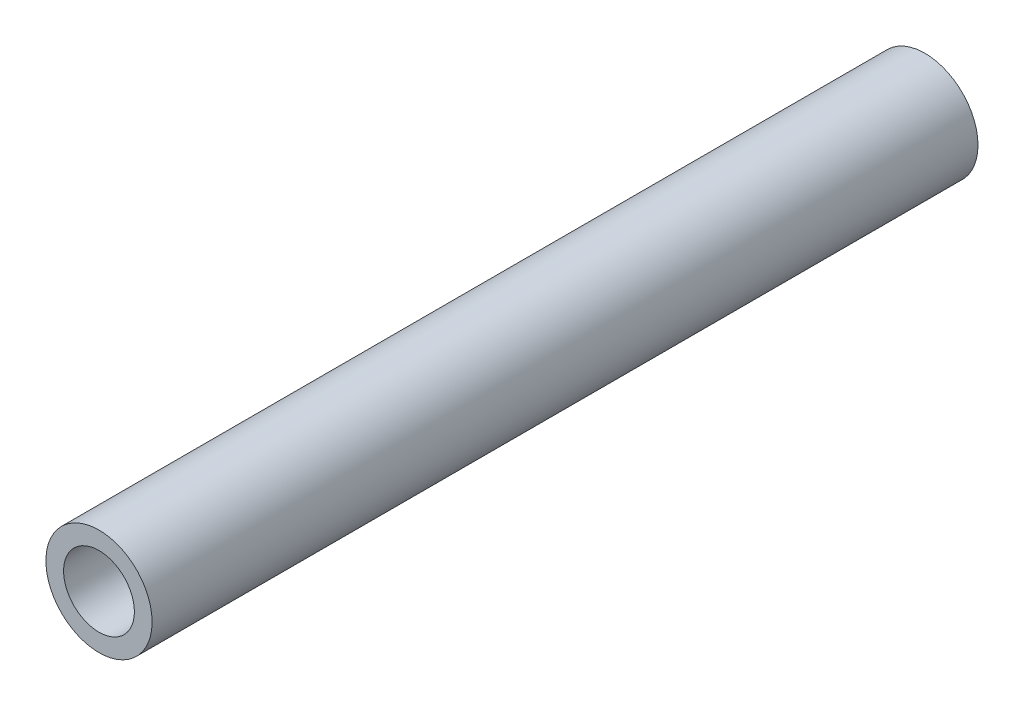
ISO-10303-21;
HEADER;
FILE_DESCRIPTION(('STEP AP214'),'2;1');
FILE_NAME('part.step','',(''),(''),'','','');
FILE_SCHEMA(('AUTOMOTIVE_DESIGN { 1 0 10303 214 1 1 1 1 }'));
ENDSEC;
DATA;
#1=APPLICATION_CONTEXT('core data for automotive mechanical design processes');
#2=APPLICATION_PROTOCOL_DEFINITION('international standard','automotive_design',2000,#1);
#3=PRODUCT_CONTEXT('',#1,'mechanical');
#4=PRODUCT('Part','Part','',(#3));
#5=PRODUCT_RELATED_PRODUCT_CATEGORY('part','',(#4));
#6=PRODUCT_DEFINITION_FORMATION('','',#4);
#7=PRODUCT_DEFINITION_CONTEXT('part definition',#1,'design');
#8=PRODUCT_DEFINITION('design','',#6,#7);
#9=PRODUCT_DEFINITION_SHAPE('','',#8);
#10=(LENGTH_UNIT() NAMED_UNIT(*) SI_UNIT(.MILLI.,.METRE.));
#11=(NAMED_UNIT(*) PLANE_ANGLE_UNIT() SI_UNIT($,.RADIAN.));
#12=(NAMED_UNIT(*) SI_UNIT($,.STERADIAN.) SOLID_ANGLE_UNIT());
#13=UNCERTAINTY_MEASURE_WITH_UNIT(LENGTH_MEASURE(1.E-05),#10,'distance_accuracy_value','');
#14=(GEOMETRIC_REPRESENTATION_CONTEXT(3) GLOBAL_UNCERTAINTY_ASSIGNED_CONTEXT((#13)) GLOBAL_UNIT_ASSIGNED_CONTEXT((#10,
#11,#12)) REPRESENTATION_CONTEXT('',''));
#15=CARTESIAN_POINT('',(0.,0.,0.));
#16=DIRECTION('',(0.,0.,1.));
#17=DIRECTION('',(1.,0.,0.));
#18=AXIS2_PLACEMENT_3D('',#15,#16,#17);
#19=CARTESIAN_POINT('',(0.,0.,35.));
#20=DIRECTION('',(0.,0.,1.));
#21=DIRECTION('',(1.,0.,0.));
#22=AXIS2_PLACEMENT_3D('',#19,#20,#21);
#23=PLANE('',#22);
#24=CARTESIAN_POINT('',(0.,0.,35.));
#25=DIRECTION('',(0.,0.,1.));
#26=DIRECTION('',(1.,0.,0.));
#27=AXIS2_PLACEMENT_3D('',#24,#25,#26);
#28=CIRCLE('',#27,2.25);
#29=CARTESIAN_POINT('',(2.25,0.,35.));
#30=VERTEX_POINT('',#29);
#31=EDGE_CURVE('E10',#30,#30,#28,.T.);
#32=ORIENTED_EDGE('',*,*,#31,.T.);
#33=EDGE_LOOP('',(#32));
#34=FACE_BOUND('',#33,.T.);
#35=CARTESIAN_POINT('',(0.,0.,35.));
#36=DIRECTION('',(0.,0.,1.));
#37=DIRECTION('',(1.,0.,0.));
#38=AXIS2_PLACEMENT_3D('',#35,#36,#37);
#39=CIRCLE('',#38,1.5);
#40=CARTESIAN_POINT('',(1.5,0.,35.));
#41=VERTEX_POINT('',#40);
#42=EDGE_CURVE('E41',#41,#41,#39,.T.);
#43=ORIENTED_EDGE('',*,*,#42,.F.);
#44=EDGE_LOOP('',(#43));
#45=FACE_BOUND('',#44,.T.);
#46=ADVANCED_FACE('F30',(#34,#45),#23,.T.);
#47=CARTESIAN_POINT('',(0.,0.,0.));
#48=DIRECTION('',(0.,0.,1.));
#49=DIRECTION('',(1.,0.,0.));
#50=AXIS2_PLACEMENT_3D('',#47,#48,#49);
#51=PLANE('',#50);
#52=CARTESIAN_POINT('',(0.,0.,0.));
#53=DIRECTION('',(0.,0.,1.));
#54=DIRECTION('',(1.,0.,0.));
#55=AXIS2_PLACEMENT_3D('',#52,#53,#54);
#56=CIRCLE('',#55,2.25);
#57=CARTESIAN_POINT('',(2.25,0.,0.));
#58=VERTEX_POINT('',#57);
#59=EDGE_CURVE('E34',#58,#58,#56,.T.);
#60=ORIENTED_EDGE('',*,*,#59,.F.);
#61=EDGE_LOOP('',(#60));
#62=FACE_BOUND('',#61,.T.);
#63=CARTESIAN_POINT('',(0.,0.,0.));
#64=DIRECTION('',(0.,0.,1.));
#65=DIRECTION('',(1.,0.,0.));
#66=AXIS2_PLACEMENT_3D('',#63,#64,#65);
#67=CIRCLE('',#66,1.5);
#68=CARTESIAN_POINT('',(1.5,0.,0.));
#69=VERTEX_POINT('',#68);
#70=EDGE_CURVE('E43',#69,#69,#67,.T.);
#71=ORIENTED_EDGE('',*,*,#70,.T.);
#72=EDGE_LOOP('',(#71));
#73=FACE_BOUND('',#72,.T.);
#74=ADVANCED_FACE('F53',(#62,#73),#51,.F.);
#75=CARTESIAN_POINT('',(0.,0.,35.));
#76=DIRECTION('',(0.,0.,-1.));
#77=DIRECTION('',(-1.,0.,0.));
#78=AXIS2_PLACEMENT_3D('',#75,#76,#77);
#79=CYLINDRICAL_SURFACE('',#78,2.25);
#80=ORIENTED_EDGE('',*,*,#31,.F.);
#81=EDGE_LOOP('',(#80));
#82=FACE_BOUND('',#81,.T.);
#83=ORIENTED_EDGE('',*,*,#59,.T.);
#84=EDGE_LOOP('',(#83));
#85=FACE_BOUND('',#84,.T.);
#86=ADVANCED_FACE('F32',(#82,#85),#79,.T.);
#87=CARTESIAN_POINT('',(0.,0.,35.));
#88=DIRECTION('',(0.,0.,-1.));
#89=DIRECTION('',(-1.,0.,0.));
#90=AXIS2_PLACEMENT_3D('',#87,#88,#89);
#91=CYLINDRICAL_SURFACE('',#90,1.5);
#92=ORIENTED_EDGE('',*,*,#42,.T.);
#93=EDGE_LOOP('',(#92));
#94=FACE_BOUND('',#93,.T.);
#95=ORIENTED_EDGE('',*,*,#70,.F.);
#96=EDGE_LOOP('',(#95));
#97=FACE_BOUND('',#96,.T.);
#98=ADVANCED_FACE('F49',(#94,#97),#91,.F.);
#99=CLOSED_SHELL('',(#46,#74,#86,#98));
#100=MANIFOLD_SOLID_BREP('B2',#99);
#101=ADVANCED_BREP_SHAPE_REPRESENTATION('',(#18,#100),#14);
#102=SHAPE_DEFINITION_REPRESENTATION(#9,#101);
ENDSEC;
END-ISO-10303-21;
